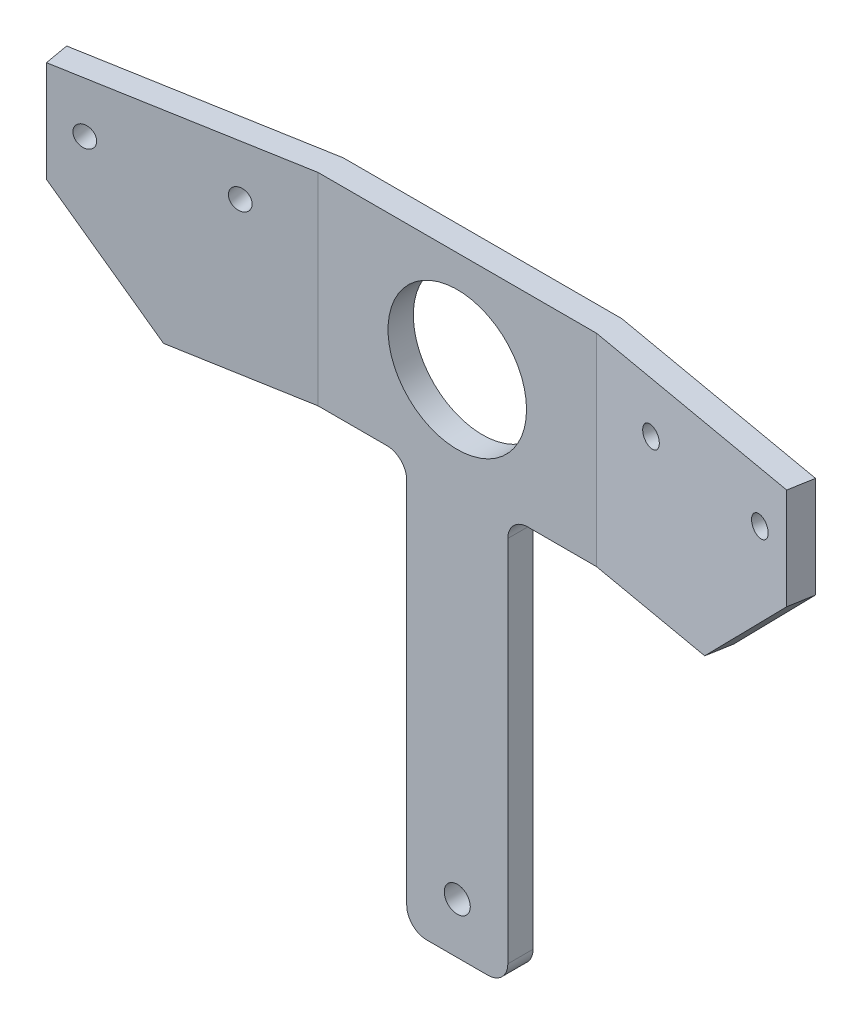
ISO-10303-21;
HEADER;
FILE_DESCRIPTION(('STEP AP214'),'2;1');
FILE_NAME('part.step','',(''),(''),'','','');
FILE_SCHEMA(('AUTOMOTIVE_DESIGN { 1 0 10303 214 1 1 1 1 }'));
ENDSEC;
DATA;
#1=APPLICATION_CONTEXT('core data for automotive mechanical design processes');
#2=APPLICATION_PROTOCOL_DEFINITION('international standard','automotive_design',2000,#1);
#3=PRODUCT_CONTEXT('',#1,'mechanical');
#4=PRODUCT('Part','Part','',(#3));
#5=PRODUCT_RELATED_PRODUCT_CATEGORY('part','',(#4));
#6=PRODUCT_DEFINITION_FORMATION('','',#4);
#7=PRODUCT_DEFINITION_CONTEXT('part definition',#1,'design');
#8=PRODUCT_DEFINITION('design','',#6,#7);
#9=PRODUCT_DEFINITION_SHAPE('','',#8);
#10=(LENGTH_UNIT() NAMED_UNIT(*) SI_UNIT(.MILLI.,.METRE.));
#11=(NAMED_UNIT(*) PLANE_ANGLE_UNIT() SI_UNIT($,.RADIAN.));
#12=(NAMED_UNIT(*) SI_UNIT($,.STERADIAN.) SOLID_ANGLE_UNIT());
#13=UNCERTAINTY_MEASURE_WITH_UNIT(LENGTH_MEASURE(1.E-05),#10,'distance_accuracy_value','');
#14=(GEOMETRIC_REPRESENTATION_CONTEXT(3) GLOBAL_UNCERTAINTY_ASSIGNED_CONTEXT((#13)) GLOBAL_UNIT_ASSIGNED_CONTEXT((#10,
#11,#12)) REPRESENTATION_CONTEXT('',''));
#15=CARTESIAN_POINT('',(0.,0.,0.));
#16=DIRECTION('',(0.,0.,1.));
#17=DIRECTION('',(1.,0.,0.));
#18=AXIS2_PLACEMENT_3D('',#15,#16,#17);
#19=CARTESIAN_POINT('',(0.,102.57,6.35));
#20=DIRECTION('',(0.,-1.,0.));
#21=DIRECTION('',(0.,0.,-1.));
#22=AXIS2_PLACEMENT_3D('',#19,#20,#21);
#23=PLANE('',#22);
#24=DIRECTION('',(0.984807753012208,0.,0.173648177666931));
#25=VECTOR('',#24,1.);
#26=CARTESIAN_POINT('',(35.,102.57,0.));
#27=LINE('',#26,#25);
#28=CARTESIAN_POINT('',(35.,102.57,0.));
#29=VERTEX_POINT('',#28);
#30=CARTESIAN_POINT('',(69.0743482542221,102.57,6.00822694727578));
#31=VERTEX_POINT('',#30);
#32=EDGE_CURVE('E203',#29,#31,#27,.T.);
#33=ORIENTED_EDGE('',*,*,#32,.T.);
#34=DIRECTION('',(-0.173648177666931,0.,0.984807753012208));
#35=VECTOR('',#34,1.);
#36=CARTESIAN_POINT('',(70.8560834926387,102.57,-4.09649571772824));
#37=LINE('',#36,#35);
#38=CARTESIAN_POINT('',(67.9884342991631,102.57,12.166751018271));
#39=VERTEX_POINT('',#38);
#40=EDGE_CURVE('E168',#31,#39,#37,.T.);
#41=ORIENTED_EDGE('',*,*,#40,.T.);
#42=DIRECTION('',(-0.984807753012208,0.,-0.173648177666931));
#43=VECTOR('',#42,1.);
#44=CARTESIAN_POINT('',(93.0025512256735,102.57,16.5774147310111));
#45=LINE('',#44,#43);
#46=CARTESIAN_POINT('',(35.,102.57,6.35));
#47=VERTEX_POINT('',#46);
#48=EDGE_CURVE('E194',#39,#47,#45,.T.);
#49=ORIENTED_EDGE('',*,*,#48,.T.);
#50=DIRECTION('',(-1.,0.,0.));
#51=VECTOR('',#50,1.);
#52=CARTESIAN_POINT('',(0.,102.57,6.35));
#53=LINE('',#52,#51);
#54=CARTESIAN_POINT('',(17.7,102.57,6.35));
#55=VERTEX_POINT('',#54);
#56=EDGE_CURVE('E252',#47,#55,#53,.T.);
#57=ORIENTED_EDGE('',*,*,#56,.T.);
#58=DIRECTION('',(0.,0.,-1.));
#59=VECTOR('',#58,1.);
#60=CARTESIAN_POINT('',(17.7,102.57,6.35));
#61=LINE('',#60,#59);
#62=CARTESIAN_POINT('',(17.7,102.57,0.));
#63=VERTEX_POINT('',#62);
#64=EDGE_CURVE('E304',#55,#63,#61,.T.);
#65=ORIENTED_EDGE('',*,*,#64,.T.);
#66=DIRECTION('',(-1.,0.,0.));
#67=VECTOR('',#66,1.);
#68=CARTESIAN_POINT('',(0.,102.57,0.));
#69=LINE('',#68,#67);
#70=EDGE_CURVE('E228',#29,#63,#69,.T.);
#71=ORIENTED_EDGE('',*,*,#70,.F.);
#72=EDGE_LOOP('',(#33,#41,#49,#57,#65,#71));
#73=FACE_BOUND('',#72,.T.);
#74=ADVANCED_FACE('F41',(#73),#23,.T.);
#75=CARTESIAN_POINT('',(35.,41.2001589004943,0.));
#76=DIRECTION('',(-0.173648177666931,0.,0.984807753012208));
#77=DIRECTION('',(0.984807753012208,0.,0.173648177666931));
#78=AXIS2_PLACEMENT_3D('',#75,#76,#77);
#79=PLANE('',#78);
#80=CARTESIAN_POINT('',(85.9086125588069,140.67,8.97656194455152));
#81=DIRECTION('',(0.173648177666931,0.,-0.984807753012208));
#82=DIRECTION('',(-0.984807753012208,0.,-0.173648177666931));
#83=AXIS2_PLACEMENT_3D('',#80,#81,#82);
#84=CIRCLE('',#83,2.57499999999998);
#85=CARTESIAN_POINT('',(83.3727325948005,140.67,8.52941788705917));
#86=VERTEX_POINT('',#85);
#87=EDGE_CURVE('E321',#86,#86,#84,.T.);
#88=ORIENTED_EDGE('',*,*,#87,.F.);
#89=EDGE_LOOP('',(#88));
#90=FACE_BOUND('',#89,.T.);
#91=CARTESIAN_POINT('',(52.6934801563083,140.67,3.119837934187));
#92=DIRECTION('',(0.173648177666931,0.,-0.984807753012208));
#93=DIRECTION('',(-0.984807753012208,0.,-0.173648177666931));
#94=AXIS2_PLACEMENT_3D('',#91,#92,#93);
#95=CIRCLE('',#94,2.575);
#96=CARTESIAN_POINT('',(50.1576001923019,140.67,2.67269387669465));
#97=VERTEX_POINT('',#96);
#98=EDGE_CURVE('E329',#97,#97,#95,.T.);
#99=ORIENTED_EDGE('',*,*,#98,.F.);
#100=EDGE_LOOP('',(#99));
#101=FACE_BOUND('',#100,.T.);
#102=DIRECTION('',(0.696364240320023,0.707106781186544,0.122787803968974));
#103=VECTOR('',#102,1.);
#104=CARTESIAN_POINT('',(21.8184264691507,54.5850794502476,-2.3242670616813));
#105=LINE('',#104,#103);
#106=CARTESIAN_POINT('',(94.0884651807325,127.97,10.4188906600159));
#107=VERTEX_POINT('',#106);
#108=EDGE_CURVE('E165',#31,#107,#105,.T.);
#109=ORIENTED_EDGE('',*,*,#108,.F.);
#110=ORIENTED_EDGE('',*,*,#32,.F.);
#111=DIRECTION('',(0.,-1.,0.));
#112=VECTOR('',#111,1.);
#113=CARTESIAN_POINT('',(35.,0.,0.));
#114=LINE('',#113,#112);
#115=CARTESIAN_POINT('',(35.,153.37,0.));
#116=VERTEX_POINT('',#115);
#117=EDGE_CURVE('E261',#116,#29,#114,.T.);
#118=ORIENTED_EDGE('',*,*,#117,.F.);
#119=DIRECTION('',(0.984807753012208,0.,0.173648177666931));
#120=VECTOR('',#119,1.);
#121=CARTESIAN_POINT('',(35.,153.37,0.));
#122=LINE('',#121,#120);
#123=CARTESIAN_POINT('',(94.0884651807325,153.37,10.4188906600159));
#124=VERTEX_POINT('',#123);
#125=EDGE_CURVE('E173',#116,#124,#122,.T.);
#126=ORIENTED_EDGE('',*,*,#125,.T.);
#127=DIRECTION('',(0.,1.,0.));
#128=VECTOR('',#127,1.);
#129=CARTESIAN_POINT('',(94.0884651807325,41.2001589004943,10.4188906600159));
#130=LINE('',#129,#128);
#131=EDGE_CURVE('E179',#107,#124,#130,.T.);
#132=ORIENTED_EDGE('',*,*,#131,.F.);
#133=EDGE_LOOP('',(#109,#110,#118,#126,#132));
#134=FACE_BOUND('',#133,.T.);
#135=ADVANCED_FACE('F184',(#90,#101,#134),#79,.F.);
#136=CARTESIAN_POINT('',(94.0884651807325,41.2001589004943,10.4188906600159));
#137=DIRECTION('',(-0.984807753012208,0.,-0.173648177666932));
#138=DIRECTION('',(-0.173648177666932,0.,0.984807753012208));
#139=AXIS2_PLACEMENT_3D('',#136,#137,#138);
#140=PLANE('',#139);
#141=DIRECTION('',(-0.173648177666931,0.,0.984807753012208));
#142=VECTOR('',#141,1.);
#143=CARTESIAN_POINT('',(95.8702004191491,127.97,0.314167995011872));
#144=LINE('',#143,#142);
#145=CARTESIAN_POINT('',(93.0025512256735,127.97,16.5774147310111));
#146=VERTEX_POINT('',#145);
#147=EDGE_CURVE('E57',#107,#146,#144,.T.);
#148=ORIENTED_EDGE('',*,*,#147,.F.);
#149=ORIENTED_EDGE('',*,*,#131,.T.);
#150=DIRECTION('',(-0.173648177666932,0.,0.984807753012208));
#151=VECTOR('',#150,1.);
#152=CARTESIAN_POINT('',(94.0884651807325,153.37,10.4188906600159));
#153=LINE('',#152,#151);
#154=CARTESIAN_POINT('',(93.0025512256735,153.37,16.5774147310111));
#155=VERTEX_POINT('',#154);
#156=EDGE_CURVE('E188',#124,#155,#153,.T.);
#157=ORIENTED_EDGE('',*,*,#156,.T.);
#158=DIRECTION('',(0.,1.,0.));
#159=VECTOR('',#158,1.);
#160=CARTESIAN_POINT('',(93.0025512256735,41.2001589004943,16.5774147310111));
#161=LINE('',#160,#159);
#162=EDGE_CURVE('E181',#146,#155,#161,.T.);
#163=ORIENTED_EDGE('',*,*,#162,.F.);
#164=EDGE_LOOP('',(#148,#149,#157,#163));
#165=FACE_BOUND('',#164,.T.);
#166=ADVANCED_FACE('F177',(#165),#140,.F.);
#167=CARTESIAN_POINT('',(93.0025512256735,41.2001589004943,16.5774147310111));
#168=DIRECTION('',(0.173648177666931,0.,-0.984807753012208));
#169=DIRECTION('',(-0.984807753012208,0.,-0.173648177666931));
#170=AXIS2_PLACEMENT_3D('',#167,#168,#169);
#171=PLANE('',#170);
#172=CARTESIAN_POINT('',(84.8226986037479,140.67,15.1350860155468));
#173=DIRECTION('',(0.173648177666931,0.,-0.984807753012208));
#174=DIRECTION('',(-0.984807753012208,0.,-0.173648177666931));
#175=AXIS2_PLACEMENT_3D('',#172,#173,#174);
#176=CIRCLE('',#175,2.57499999999998);
#177=CARTESIAN_POINT('',(82.2868186397415,140.67,14.6879419580544));
#178=VERTEX_POINT('',#177);
#179=EDGE_CURVE('E182',#178,#178,#176,.T.);
#180=ORIENTED_EDGE('',*,*,#179,.T.);
#181=EDGE_LOOP('',(#180));
#182=FACE_BOUND('',#181,.T.);
#183=CARTESIAN_POINT('',(51.6075662012493,140.67,9.27836200518226));
#184=DIRECTION('',(0.173648177666931,0.,-0.984807753012208));
#185=DIRECTION('',(-0.984807753012208,0.,-0.173648177666931));
#186=AXIS2_PLACEMENT_3D('',#183,#184,#185);
#187=CIRCLE('',#186,2.575);
#188=CARTESIAN_POINT('',(49.0716862372429,140.67,8.83121794768991));
#189=VERTEX_POINT('',#188);
#190=EDGE_CURVE('E318',#189,#189,#187,.T.);
#191=ORIENTED_EDGE('',*,*,#190,.T.);
#192=EDGE_LOOP('',(#191));
#193=FACE_BOUND('',#192,.T.);
#194=DIRECTION('',(-0.696364240320023,-0.707106781186544,-0.122787803968974));
#195=VECTOR('',#194,1.);
#196=CARTESIAN_POINT('',(50.2767451044582,84.5850794502476,9.04370233932196));
#197=LINE('',#196,#195);
#198=EDGE_CURVE('E11',#146,#39,#197,.T.);
#199=ORIENTED_EDGE('',*,*,#198,.F.);
#200=ORIENTED_EDGE('',*,*,#162,.T.);
#201=DIRECTION('',(-0.984807753012208,0.,-0.173648177666931));
#202=VECTOR('',#201,1.);
#203=CARTESIAN_POINT('',(93.0025512256735,153.37,16.5774147310111));
#204=LINE('',#203,#202);
#205=CARTESIAN_POINT('',(35.,153.37,6.35));
#206=VERTEX_POINT('',#205);
#207=EDGE_CURVE('E197',#155,#206,#204,.T.);
#208=ORIENTED_EDGE('',*,*,#207,.T.);
#209=DIRECTION('',(0.,-1.,0.));
#210=VECTOR('',#209,1.);
#211=CARTESIAN_POINT('',(35.,0.,6.35));
#212=LINE('',#211,#210);
#213=EDGE_CURVE('E231',#206,#47,#212,.T.);
#214=ORIENTED_EDGE('',*,*,#213,.T.);
#215=ORIENTED_EDGE('',*,*,#48,.F.);
#216=EDGE_LOOP('',(#199,#200,#208,#214,#215));
#217=FACE_BOUND('',#216,.T.);
#218=ADVANCED_FACE('F353',(#182,#193,#217),#171,.F.);
#219=CARTESIAN_POINT('',(0.,153.37,6.35));
#220=DIRECTION('',(0.,1.,0.));
#221=DIRECTION('',(0.,0.,1.));
#222=AXIS2_PLACEMENT_3D('',#219,#220,#221);
#223=PLANE('',#222);
#224=DIRECTION('',(1.,0.,0.));
#225=VECTOR('',#224,1.);
#226=CARTESIAN_POINT('',(0.,153.37,0.));
#227=LINE('',#226,#225);
#228=CARTESIAN_POINT('',(-35.,153.37,0.));
#229=VERTEX_POINT('',#228);
#230=EDGE_CURVE('E264',#229,#116,#227,.T.);
#231=ORIENTED_EDGE('',*,*,#230,.F.);
#232=DIRECTION('',(-0.984807753012208,0.,0.173648177666931));
#233=VECTOR('',#232,1.);
#234=CARTESIAN_POINT('',(-35.,153.37,0.));
#235=LINE('',#234,#233);
#236=CARTESIAN_POINT('',(-94.0884651807325,153.37,10.4188906600159));
#237=VERTEX_POINT('',#236);
#238=EDGE_CURVE('E205',#229,#237,#235,.T.);
#239=ORIENTED_EDGE('',*,*,#238,.T.);
#240=DIRECTION('',(0.173648177666932,0.,0.984807753012208));
#241=VECTOR('',#240,1.);
#242=CARTESIAN_POINT('',(-94.0884651807325,153.37,10.4188906600159));
#243=LINE('',#242,#241);
#244=CARTESIAN_POINT('',(-93.0025512256735,153.37,16.5774147310111));
#245=VERTEX_POINT('',#244);
#246=EDGE_CURVE('E210',#237,#245,#243,.T.);
#247=ORIENTED_EDGE('',*,*,#246,.T.);
#248=DIRECTION('',(0.984807753012208,0.,-0.173648177666931));
#249=VECTOR('',#248,1.);
#250=CARTESIAN_POINT('',(-93.0025512256735,153.37,16.5774147310111));
#251=LINE('',#250,#249);
#252=CARTESIAN_POINT('',(-35.,153.37,6.35));
#253=VERTEX_POINT('',#252);
#254=EDGE_CURVE('E206',#245,#253,#251,.T.);
#255=ORIENTED_EDGE('',*,*,#254,.T.);
#256=DIRECTION('',(1.,0.,0.));
#257=VECTOR('',#256,1.);
#258=CARTESIAN_POINT('',(0.,153.37,6.35));
#259=LINE('',#258,#257);
#260=EDGE_CURVE('E234',#253,#206,#259,.T.);
#261=ORIENTED_EDGE('',*,*,#260,.T.);
#262=ORIENTED_EDGE('',*,*,#207,.F.);
#263=ORIENTED_EDGE('',*,*,#156,.F.);
#264=ORIENTED_EDGE('',*,*,#125,.F.);
#265=EDGE_LOOP('',(#231,#239,#247,#255,#261,#262,#263,#264));
#266=FACE_BOUND('',#265,.T.);
#267=ADVANCED_FACE('F356',(#266),#223,.T.);
#268=CARTESIAN_POINT('',(0.,102.57,6.35));
#269=DIRECTION('',(0.,-1.,0.));
#270=DIRECTION('',(0.,0.,-1.));
#271=AXIS2_PLACEMENT_3D('',#268,#269,#270);
#272=PLANE('',#271);
#273=DIRECTION('',(0.173648177666931,0.,0.984807753012208));
#274=VECTOR('',#273,1.);
#275=CARTESIAN_POINT('',(-70.8560834926387,102.57,-4.09649571772824));
#276=LINE('',#275,#274);
#277=CARTESIAN_POINT('',(-69.0743482542221,102.57,6.00822694727578));
#278=VERTEX_POINT('',#277);
#279=CARTESIAN_POINT('',(-67.9884342991631,102.57,12.166751018271));
#280=VERTEX_POINT('',#279);
#281=EDGE_CURVE('E65',#278,#280,#276,.T.);
#282=ORIENTED_EDGE('',*,*,#281,.F.);
#283=DIRECTION('',(-0.984807753012208,0.,0.173648177666931));
#284=VECTOR('',#283,1.);
#285=CARTESIAN_POINT('',(-35.,102.57,0.));
#286=LINE('',#285,#284);
#287=CARTESIAN_POINT('',(-35.,102.57,0.));
#288=VERTEX_POINT('',#287);
#289=EDGE_CURVE('E209',#288,#278,#286,.T.);
#290=ORIENTED_EDGE('',*,*,#289,.F.);
#291=DIRECTION('',(-1.,0.,0.));
#292=VECTOR('',#291,1.);
#293=CARTESIAN_POINT('',(0.,102.57,0.));
#294=LINE('',#293,#292);
#295=CARTESIAN_POINT('',(-17.7,102.57,0.));
#296=VERTEX_POINT('',#295);
#297=EDGE_CURVE('E269',#296,#288,#294,.T.);
#298=ORIENTED_EDGE('',*,*,#297,.F.);
#299=DIRECTION('',(0.,0.,-1.));
#300=VECTOR('',#299,1.);
#301=CARTESIAN_POINT('',(-17.7,102.57,6.35));
#302=LINE('',#301,#300);
#303=CARTESIAN_POINT('',(-17.7,102.57,6.35));
#304=VERTEX_POINT('',#303);
#305=EDGE_CURVE('E307',#296,#304,#302,.F.);
#306=ORIENTED_EDGE('',*,*,#305,.T.);
#307=DIRECTION('',(-1.,0.,0.));
#308=VECTOR('',#307,1.);
#309=CARTESIAN_POINT('',(0.,102.57,6.35));
#310=LINE('',#309,#308);
#311=CARTESIAN_POINT('',(-35.,102.57,6.35));
#312=VERTEX_POINT('',#311);
#313=EDGE_CURVE('E240',#304,#312,#310,.T.);
#314=ORIENTED_EDGE('',*,*,#313,.T.);
#315=DIRECTION('',(0.984807753012208,0.,-0.173648177666931));
#316=VECTOR('',#315,1.);
#317=CARTESIAN_POINT('',(-93.0025512256735,102.57,16.5774147310111));
#318=LINE('',#317,#316);
#319=EDGE_CURVE('E218',#280,#312,#318,.T.);
#320=ORIENTED_EDGE('',*,*,#319,.F.);
#321=EDGE_LOOP('',(#282,#290,#298,#306,#314,#320));
#322=FACE_BOUND('',#321,.T.);
#323=ADVANCED_FACE('F365',(#322),#272,.T.);
#324=CARTESIAN_POINT('',(-12.7,0.,6.35));
#325=DIRECTION('',(-1.,0.,0.));
#326=DIRECTION('',(0.,0.,1.));
#327=AXIS2_PLACEMENT_3D('',#324,#325,#326);
#328=PLANE('',#327);
#329=DIRECTION('',(0.,1.,0.));
#330=VECTOR('',#329,1.);
#331=CARTESIAN_POINT('',(-12.7,0.,0.));
#332=LINE('',#331,#330);
#333=CARTESIAN_POINT('',(-12.7,5.,0.));
#334=VERTEX_POINT('',#333);
#335=CARTESIAN_POINT('',(-12.7,97.57,0.));
#336=VERTEX_POINT('',#335);
#337=EDGE_CURVE('E271',#334,#336,#332,.T.);
#338=ORIENTED_EDGE('',*,*,#337,.F.);
#339=DIRECTION('',(0.,0.,-1.));
#340=VECTOR('',#339,1.);
#341=CARTESIAN_POINT('',(-12.7,5.,6.35));
#342=LINE('',#341,#340);
#343=CARTESIAN_POINT('',(-12.7,5.,6.35));
#344=VERTEX_POINT('',#343);
#345=EDGE_CURVE('E293',#334,#344,#342,.F.);
#346=ORIENTED_EDGE('',*,*,#345,.T.);
#347=DIRECTION('',(0.,1.,0.));
#348=VECTOR('',#347,1.);
#349=CARTESIAN_POINT('',(-12.7,0.,6.35));
#350=LINE('',#349,#348);
#351=CARTESIAN_POINT('',(-12.7,97.57,6.35));
#352=VERTEX_POINT('',#351);
#353=EDGE_CURVE('E243',#344,#352,#350,.T.);
#354=ORIENTED_EDGE('',*,*,#353,.T.);
#355=DIRECTION('',(0.,0.,-1.));
#356=VECTOR('',#355,1.);
#357=CARTESIAN_POINT('',(-12.7,97.57,0.));
#358=LINE('',#357,#356);
#359=EDGE_CURVE('E290',#352,#336,#358,.T.);
#360=ORIENTED_EDGE('',*,*,#359,.T.);
#361=EDGE_LOOP('',(#338,#346,#354,#360));
#362=FACE_BOUND('',#361,.T.);
#363=ADVANCED_FACE('F373',(#362),#328,.T.);
#364=CARTESIAN_POINT('',(0.,0.,6.35));
#365=DIRECTION('',(0.,1.,0.));
#366=DIRECTION('',(-1.,0.,0.));
#367=AXIS2_PLACEMENT_3D('',#364,#365,#366);
#368=PLANE('',#367);
#369=DIRECTION('',(1.,0.,0.));
#370=VECTOR('',#369,1.);
#371=CARTESIAN_POINT('',(0.,0.,6.35));
#372=LINE('',#371,#370);
#373=CARTESIAN_POINT('',(-7.7,0.,6.35));
#374=VERTEX_POINT('',#373);
#375=CARTESIAN_POINT('',(7.7,0.,6.35));
#376=VERTEX_POINT('',#375);
#377=EDGE_CURVE('E246',#374,#376,#372,.T.);
#378=ORIENTED_EDGE('',*,*,#377,.F.);
#379=DIRECTION('',(0.,0.,-1.));
#380=VECTOR('',#379,1.);
#381=CARTESIAN_POINT('',(-7.7,0.,0.));
#382=LINE('',#381,#380);
#383=CARTESIAN_POINT('',(-7.7,0.,0.));
#384=VERTEX_POINT('',#383);
#385=EDGE_CURVE('E283',#374,#384,#382,.T.);
#386=ORIENTED_EDGE('',*,*,#385,.T.);
#387=DIRECTION('',(1.,0.,0.));
#388=VECTOR('',#387,1.);
#389=CARTESIAN_POINT('',(0.,0.,0.));
#390=LINE('',#389,#388);
#391=CARTESIAN_POINT('',(7.7,0.,0.));
#392=VERTEX_POINT('',#391);
#393=EDGE_CURVE('E274',#384,#392,#390,.T.);
#394=ORIENTED_EDGE('',*,*,#393,.T.);
#395=DIRECTION('',(0.,0.,-1.));
#396=VECTOR('',#395,1.);
#397=CARTESIAN_POINT('',(7.7,0.,6.35));
#398=LINE('',#397,#396);
#399=EDGE_CURVE('E255',#392,#376,#398,.F.);
#400=ORIENTED_EDGE('',*,*,#399,.T.);
#401=EDGE_LOOP('',(#378,#386,#394,#400));
#402=FACE_BOUND('',#401,.T.);
#403=ADVANCED_FACE('F384',(#402),#368,.F.);
#404=CARTESIAN_POINT('',(12.7,0.,6.35));
#405=DIRECTION('',(-1.,0.,0.));
#406=DIRECTION('',(0.,-1.,0.));
#407=AXIS2_PLACEMENT_3D('',#404,#405,#406);
#408=PLANE('',#407);
#409=DIRECTION('',(0.,1.,0.));
#410=VECTOR('',#409,1.);
#411=CARTESIAN_POINT('',(12.7,0.,6.35));
#412=LINE('',#411,#410);
#413=CARTESIAN_POINT('',(12.7,5.00000000000001,6.35));
#414=VERTEX_POINT('',#413);
#415=CARTESIAN_POINT('',(12.7,97.57,6.35));
#416=VERTEX_POINT('',#415);
#417=EDGE_CURVE('E249',#414,#416,#412,.T.);
#418=ORIENTED_EDGE('',*,*,#417,.F.);
#419=DIRECTION('',(0.,0.,-1.));
#420=VECTOR('',#419,1.);
#421=CARTESIAN_POINT('',(12.7,5.00000000000001,6.35));
#422=LINE('',#421,#420);
#423=CARTESIAN_POINT('',(12.7,5.00000000000001,0.));
#424=VERTEX_POINT('',#423);
#425=EDGE_CURVE('E301',#414,#424,#422,.T.);
#426=ORIENTED_EDGE('',*,*,#425,.T.);
#427=DIRECTION('',(0.,1.,0.));
#428=VECTOR('',#427,1.);
#429=CARTESIAN_POINT('',(12.7,0.,0.));
#430=LINE('',#429,#428);
#431=CARTESIAN_POINT('',(12.7,97.57,0.));
#432=VERTEX_POINT('',#431);
#433=EDGE_CURVE('E277',#424,#432,#430,.T.);
#434=ORIENTED_EDGE('',*,*,#433,.T.);
#435=DIRECTION('',(0.,0.,-1.));
#436=VECTOR('',#435,1.);
#437=CARTESIAN_POINT('',(12.7,97.57,6.35));
#438=LINE('',#437,#436);
#439=EDGE_CURVE('E299',#432,#416,#438,.F.);
#440=ORIENTED_EDGE('',*,*,#439,.T.);
#441=EDGE_LOOP('',(#418,#426,#434,#440));
#442=FACE_BOUND('',#441,.T.);
#443=ADVANCED_FACE('F393',(#442),#408,.F.);
#444=CARTESIAN_POINT('',(0.,127.97,6.35));
#445=DIRECTION('',(0.,0.,-1.));
#446=DIRECTION('',(-1.,0.,0.));
#447=AXIS2_PLACEMENT_3D('',#444,#445,#446);
#448=CYLINDRICAL_SURFACE('',#447,17.4);
#449=CARTESIAN_POINT('',(0.,127.97,6.35));
#450=DIRECTION('',(0.,0.,1.));
#451=DIRECTION('',(1.,0.,0.));
#452=AXIS2_PLACEMENT_3D('',#449,#450,#451);
#453=CIRCLE('',#452,17.4);
#454=CARTESIAN_POINT('',(17.4,127.97,6.35));
#455=VERTEX_POINT('',#454);
#456=EDGE_CURVE('E227',#455,#455,#453,.T.);
#457=ORIENTED_EDGE('',*,*,#456,.T.);
#458=EDGE_LOOP('',(#457));
#459=FACE_BOUND('',#458,.T.);
#460=CARTESIAN_POINT('',(0.,127.97,0.));
#461=DIRECTION('',(0.,0.,1.));
#462=DIRECTION('',(1.,0.,0.));
#463=AXIS2_PLACEMENT_3D('',#460,#461,#462);
#464=CIRCLE('',#463,17.4);
#465=CARTESIAN_POINT('',(17.4,127.97,0.));
#466=VERTEX_POINT('',#465);
#467=EDGE_CURVE('E258',#466,#466,#464,.T.);
#468=ORIENTED_EDGE('',*,*,#467,.F.);
#469=EDGE_LOOP('',(#468));
#470=FACE_BOUND('',#469,.T.);
#471=ADVANCED_FACE('F432',(#459,#470),#448,.F.);
#472=CARTESIAN_POINT('',(0.,12.7,6.35));
#473=DIRECTION('',(0.,0.,-1.));
#474=DIRECTION('',(-1.,0.,0.));
#475=AXIS2_PLACEMENT_3D('',#472,#473,#474);
#476=CYLINDRICAL_SURFACE('',#475,3.265);
#477=CARTESIAN_POINT('',(0.,12.7,6.35));
#478=DIRECTION('',(0.,0.,1.));
#479=DIRECTION('',(1.,0.,0.));
#480=AXIS2_PLACEMENT_3D('',#477,#478,#479);
#481=CIRCLE('',#480,3.265);
#482=CARTESIAN_POINT('',(3.265,12.7,6.35));
#483=VERTEX_POINT('',#482);
#484=EDGE_CURVE('E224',#483,#483,#481,.T.);
#485=ORIENTED_EDGE('',*,*,#484,.T.);
#486=EDGE_LOOP('',(#485));
#487=FACE_BOUND('',#486,.T.);
#488=CARTESIAN_POINT('',(0.,12.7,0.));
#489=DIRECTION('',(0.,0.,1.));
#490=DIRECTION('',(1.,0.,0.));
#491=AXIS2_PLACEMENT_3D('',#488,#489,#490);
#492=CIRCLE('',#491,3.265);
#493=CARTESIAN_POINT('',(3.265,12.7,0.));
#494=VERTEX_POINT('',#493);
#495=EDGE_CURVE('E220',#494,#494,#492,.T.);
#496=ORIENTED_EDGE('',*,*,#495,.F.);
#497=EDGE_LOOP('',(#496));
#498=FACE_BOUND('',#497,.T.);
#499=ADVANCED_FACE('F443',(#487,#498),#476,.F.);
#500=CARTESIAN_POINT('',(0.,0.,6.35));
#501=DIRECTION('',(0.,0.,1.));
#502=DIRECTION('',(1.,0.,0.));
#503=AXIS2_PLACEMENT_3D('',#500,#501,#502);
#504=PLANE('',#503);
#505=ORIENTED_EDGE('',*,*,#484,.F.);
#506=EDGE_LOOP('',(#505));
#507=FACE_BOUND('',#506,.T.);
#508=ORIENTED_EDGE('',*,*,#456,.F.);
#509=EDGE_LOOP('',(#508));
#510=FACE_BOUND('',#509,.T.);
#511=ORIENTED_EDGE('',*,*,#353,.F.);
#512=CARTESIAN_POINT('',(-7.7,5.,6.35));
#513=DIRECTION('',(0.,0.,1.));
#514=DIRECTION('',(1.,0.,0.));
#515=AXIS2_PLACEMENT_3D('',#512,#513,#514);
#516=CIRCLE('',#515,5.);
#517=EDGE_CURVE('E297',#344,#374,#516,.T.);
#518=ORIENTED_EDGE('',*,*,#517,.T.);
#519=ORIENTED_EDGE('',*,*,#377,.T.);
#520=CARTESIAN_POINT('',(7.7,5.,6.35));
#521=DIRECTION('',(0.,0.,1.));
#522=DIRECTION('',(1.,0.,0.));
#523=AXIS2_PLACEMENT_3D('',#520,#521,#522);
#524=CIRCLE('',#523,5.);
#525=EDGE_CURVE('E295',#376,#414,#524,.T.);
#526=ORIENTED_EDGE('',*,*,#525,.T.);
#527=ORIENTED_EDGE('',*,*,#417,.T.);
#528=CARTESIAN_POINT('',(17.7,97.57,6.35));
#529=DIRECTION('',(0.,0.,1.));
#530=DIRECTION('',(1.,0.,0.));
#531=AXIS2_PLACEMENT_3D('',#528,#529,#530);
#532=CIRCLE('',#531,5.);
#533=EDGE_CURVE('E311',#416,#55,#532,.F.);
#534=ORIENTED_EDGE('',*,*,#533,.T.);
#535=ORIENTED_EDGE('',*,*,#56,.F.);
#536=ORIENTED_EDGE('',*,*,#213,.F.);
#537=ORIENTED_EDGE('',*,*,#260,.F.);
#538=DIRECTION('',(0.,-1.,0.));
#539=VECTOR('',#538,1.);
#540=CARTESIAN_POINT('',(-35.,0.,6.35));
#541=LINE('',#540,#539);
#542=EDGE_CURVE('E237',#253,#312,#541,.T.);
#543=ORIENTED_EDGE('',*,*,#542,.T.);
#544=ORIENTED_EDGE('',*,*,#313,.F.);
#545=CARTESIAN_POINT('',(-17.7,97.57,6.35));
#546=DIRECTION('',(0.,0.,1.));
#547=DIRECTION('',(1.,0.,0.));
#548=AXIS2_PLACEMENT_3D('',#545,#546,#547);
#549=CIRCLE('',#548,5.);
#550=EDGE_CURVE('E315',#304,#352,#549,.F.);
#551=ORIENTED_EDGE('',*,*,#550,.T.);
#552=EDGE_LOOP('',(#511,#518,#519,#526,#527,#534,#535,#536,#537,#543,#544,#551));
#553=FACE_BOUND('',#552,.T.);
#554=ADVANCED_FACE('F351',(#507,#510,#553),#504,.T.);
#555=CARTESIAN_POINT('',(0.,0.,0.));
#556=DIRECTION('',(0.,0.,1.));
#557=DIRECTION('',(1.,0.,0.));
#558=AXIS2_PLACEMENT_3D('',#555,#556,#557);
#559=PLANE('',#558);
#560=ORIENTED_EDGE('',*,*,#495,.T.);
#561=EDGE_LOOP('',(#560));
#562=FACE_BOUND('',#561,.T.);
#563=ORIENTED_EDGE('',*,*,#467,.T.);
#564=EDGE_LOOP('',(#563));
#565=FACE_BOUND('',#564,.T.);
#566=ORIENTED_EDGE('',*,*,#393,.F.);
#567=CARTESIAN_POINT('',(-7.7,5.,0.));
#568=DIRECTION('',(0.,0.,1.));
#569=DIRECTION('',(1.,0.,0.));
#570=AXIS2_PLACEMENT_3D('',#567,#568,#569);
#571=CIRCLE('',#570,5.);
#572=EDGE_CURVE('E288',#384,#334,#571,.F.);
#573=ORIENTED_EDGE('',*,*,#572,.T.);
#574=ORIENTED_EDGE('',*,*,#337,.T.);
#575=CARTESIAN_POINT('',(-17.7,97.57,0.));
#576=DIRECTION('',(0.,0.,1.));
#577=DIRECTION('',(1.,0.,0.));
#578=AXIS2_PLACEMENT_3D('',#575,#576,#577);
#579=CIRCLE('',#578,5.);
#580=EDGE_CURVE('E313',#336,#296,#579,.T.);
#581=ORIENTED_EDGE('',*,*,#580,.T.);
#582=ORIENTED_EDGE('',*,*,#297,.T.);
#583=DIRECTION('',(0.,-1.,0.));
#584=VECTOR('',#583,1.);
#585=CARTESIAN_POINT('',(-35.,0.,0.));
#586=LINE('',#585,#584);
#587=EDGE_CURVE('E266',#229,#288,#586,.T.);
#588=ORIENTED_EDGE('',*,*,#587,.F.);
#589=ORIENTED_EDGE('',*,*,#230,.T.);
#590=ORIENTED_EDGE('',*,*,#117,.T.);
#591=ORIENTED_EDGE('',*,*,#70,.T.);
#592=CARTESIAN_POINT('',(17.7,97.57,0.));
#593=DIRECTION('',(0.,0.,1.));
#594=DIRECTION('',(1.,0.,0.));
#595=AXIS2_PLACEMENT_3D('',#592,#593,#594);
#596=CIRCLE('',#595,5.);
#597=EDGE_CURVE('E309',#63,#432,#596,.T.);
#598=ORIENTED_EDGE('',*,*,#597,.T.);
#599=ORIENTED_EDGE('',*,*,#433,.F.);
#600=CARTESIAN_POINT('',(7.7,5.,0.));
#601=DIRECTION('',(0.,0.,1.));
#602=DIRECTION('',(1.,0.,0.));
#603=AXIS2_PLACEMENT_3D('',#600,#601,#602);
#604=CIRCLE('',#603,5.);
#605=EDGE_CURVE('E286',#424,#392,#604,.F.);
#606=ORIENTED_EDGE('',*,*,#605,.T.);
#607=EDGE_LOOP('',(#566,#573,#574,#581,#582,#588,#589,#590,#591,#598,#599,#606));
#608=FACE_BOUND('',#607,.T.);
#609=ADVANCED_FACE('F377',(#562,#565,#608),#559,.F.);
#610=CARTESIAN_POINT('',(-7.7,5.,6.35));
#611=DIRECTION('',(0.,0.,1.));
#612=DIRECTION('',(1.,0.,0.));
#613=AXIS2_PLACEMENT_3D('',#610,#611,#612);
#614=CYLINDRICAL_SURFACE('',#613,5.);
#615=ORIENTED_EDGE('',*,*,#517,.F.);
#616=ORIENTED_EDGE('',*,*,#345,.F.);
#617=ORIENTED_EDGE('',*,*,#572,.F.);
#618=ORIENTED_EDGE('',*,*,#385,.F.);
#619=EDGE_LOOP('',(#615,#616,#617,#618));
#620=FACE_BOUND('',#619,.T.);
#621=ADVANCED_FACE('F381',(#620),#614,.T.);
#622=CARTESIAN_POINT('',(7.7,5.,6.35));
#623=DIRECTION('',(0.,0.,-1.));
#624=DIRECTION('',(-1.,0.,0.));
#625=AXIS2_PLACEMENT_3D('',#622,#623,#624);
#626=CYLINDRICAL_SURFACE('',#625,5.);
#627=ORIENTED_EDGE('',*,*,#525,.F.);
#628=ORIENTED_EDGE('',*,*,#399,.F.);
#629=ORIENTED_EDGE('',*,*,#605,.F.);
#630=ORIENTED_EDGE('',*,*,#425,.F.);
#631=EDGE_LOOP('',(#627,#628,#629,#630));
#632=FACE_BOUND('',#631,.T.);
#633=ADVANCED_FACE('F390',(#632),#626,.T.);
#634=CARTESIAN_POINT('',(17.7,97.57,6.35));
#635=DIRECTION('',(0.,0.,-1.));
#636=DIRECTION('',(-1.,0.,0.));
#637=AXIS2_PLACEMENT_3D('',#634,#635,#636);
#638=CYLINDRICAL_SURFACE('',#637,5.);
#639=ORIENTED_EDGE('',*,*,#533,.F.);
#640=ORIENTED_EDGE('',*,*,#439,.F.);
#641=ORIENTED_EDGE('',*,*,#597,.F.);
#642=ORIENTED_EDGE('',*,*,#64,.F.);
#643=EDGE_LOOP('',(#639,#640,#641,#642));
#644=FACE_BOUND('',#643,.T.);
#645=ADVANCED_FACE('F396',(#644),#638,.F.);
#646=CARTESIAN_POINT('',(-17.7,97.57,6.35));
#647=DIRECTION('',(0.,0.,1.));
#648=DIRECTION('',(1.,0.,0.));
#649=AXIS2_PLACEMENT_3D('',#646,#647,#648);
#650=CYLINDRICAL_SURFACE('',#649,5.);
#651=ORIENTED_EDGE('',*,*,#550,.F.);
#652=ORIENTED_EDGE('',*,*,#305,.F.);
#653=ORIENTED_EDGE('',*,*,#580,.F.);
#654=ORIENTED_EDGE('',*,*,#359,.F.);
#655=EDGE_LOOP('',(#651,#652,#653,#654));
#656=FACE_BOUND('',#655,.T.);
#657=ADVANCED_FACE('F43',(#656),#650,.F.);
#658=CARTESIAN_POINT('',(-35.,41.2001589004943,0.));
#659=DIRECTION('',(-0.173648177666931,0.,-0.984807753012208));
#660=DIRECTION('',(-0.984807753012208,0.,0.173648177666931));
#661=AXIS2_PLACEMENT_3D('',#658,#659,#660);
#662=PLANE('',#661);
#663=CARTESIAN_POINT('',(-85.9086125588069,140.67,8.97656194455152));
#664=DIRECTION('',(0.173648177666931,0.,0.984807753012208));
#665=DIRECTION('',(0.984807753012208,0.,-0.173648177666931));
#666=AXIS2_PLACEMENT_3D('',#663,#664,#665);
#667=CIRCLE('',#666,2.57499999999998);
#668=CARTESIAN_POINT('',(-83.3727325948005,140.67,8.52941788705917));
#669=VERTEX_POINT('',#668);
#670=EDGE_CURVE('E325',#669,#669,#667,.T.);
#671=ORIENTED_EDGE('',*,*,#670,.T.);
#672=EDGE_LOOP('',(#671));
#673=FACE_BOUND('',#672,.T.);
#674=CARTESIAN_POINT('',(-52.6934801563083,140.67,3.119837934187));
#675=DIRECTION('',(0.173648177666931,0.,0.984807753012208));
#676=DIRECTION('',(0.984807753012208,0.,-0.173648177666931));
#677=AXIS2_PLACEMENT_3D('',#674,#675,#676);
#678=CIRCLE('',#677,2.575);
#679=CARTESIAN_POINT('',(-50.1576001923019,140.67,2.67269387669465));
#680=VERTEX_POINT('',#679);
#681=EDGE_CURVE('E331',#680,#680,#678,.T.);
#682=ORIENTED_EDGE('',*,*,#681,.T.);
#683=EDGE_LOOP('',(#682));
#684=FACE_BOUND('',#683,.T.);
#685=DIRECTION('',(0.696364240320023,-0.707106781186544,-0.122787803968974));
#686=VECTOR('',#685,1.);
#687=CARTESIAN_POINT('',(-21.8184264691507,54.5850794502476,-2.3242670616813));
#688=LINE('',#687,#686);
#689=CARTESIAN_POINT('',(-94.0884651807325,127.97,10.4188906600159));
#690=VERTEX_POINT('',#689);
#691=EDGE_CURVE('E201',#690,#278,#688,.T.);
#692=ORIENTED_EDGE('',*,*,#691,.F.);
#693=DIRECTION('',(0.,1.,0.));
#694=VECTOR('',#693,1.);
#695=CARTESIAN_POINT('',(-94.0884651807325,41.2001589004943,10.4188906600159));
#696=LINE('',#695,#694);
#697=EDGE_CURVE('E217',#690,#237,#696,.T.);
#698=ORIENTED_EDGE('',*,*,#697,.T.);
#699=ORIENTED_EDGE('',*,*,#238,.F.);
#700=ORIENTED_EDGE('',*,*,#587,.T.);
#701=ORIENTED_EDGE('',*,*,#289,.T.);
#702=EDGE_LOOP('',(#692,#698,#699,#700,#701));
#703=FACE_BOUND('',#702,.T.);
#704=ADVANCED_FACE('F402',(#673,#684,#703),#662,.T.);
#705=CARTESIAN_POINT('',(-94.0884651807325,41.2001589004943,10.4188906600159));
#706=DIRECTION('',(-0.984807753012208,0.,0.173648177666932));
#707=DIRECTION('',(0.173648177666932,0.,0.984807753012208));
#708=AXIS2_PLACEMENT_3D('',#705,#706,#707);
#709=PLANE('',#708);
#710=DIRECTION('',(0.173648177666931,0.,0.984807753012208));
#711=VECTOR('',#710,1.);
#712=CARTESIAN_POINT('',(-95.8702004191491,127.97,0.314167995011872));
#713=LINE('',#712,#711);
#714=CARTESIAN_POINT('',(-93.0025512256735,127.97,16.5774147310111));
#715=VERTEX_POINT('',#714);
#716=EDGE_CURVE('E198',#690,#715,#713,.T.);
#717=ORIENTED_EDGE('',*,*,#716,.T.);
#718=DIRECTION('',(0.,1.,0.));
#719=VECTOR('',#718,1.);
#720=CARTESIAN_POINT('',(-93.0025512256735,41.2001589004943,16.5774147310111));
#721=LINE('',#720,#719);
#722=EDGE_CURVE('E221',#715,#245,#721,.T.);
#723=ORIENTED_EDGE('',*,*,#722,.T.);
#724=ORIENTED_EDGE('',*,*,#246,.F.);
#725=ORIENTED_EDGE('',*,*,#697,.F.);
#726=EDGE_LOOP('',(#717,#723,#724,#725));
#727=FACE_BOUND('',#726,.T.);
#728=ADVANCED_FACE('F406',(#727),#709,.T.);
#729=CARTESIAN_POINT('',(-93.0025512256735,41.2001589004943,16.5774147310111));
#730=DIRECTION('',(0.173648177666931,0.,0.984807753012208));
#731=DIRECTION('',(0.984807753012208,0.,-0.173648177666931));
#732=AXIS2_PLACEMENT_3D('',#729,#730,#731);
#733=PLANE('',#732);
#734=CARTESIAN_POINT('',(-84.8226986037479,140.67,15.1350860155468));
#735=DIRECTION('',(0.173648177666931,0.,0.984807753012208));
#736=DIRECTION('',(0.984807753012208,0.,-0.173648177666931));
#737=AXIS2_PLACEMENT_3D('',#734,#735,#736);
#738=CIRCLE('',#737,2.57499999999998);
#739=CARTESIAN_POINT('',(-82.2868186397415,140.67,14.6879419580544));
#740=VERTEX_POINT('',#739);
#741=EDGE_CURVE('E45',#740,#740,#738,.F.);
#742=ORIENTED_EDGE('',*,*,#741,.T.);
#743=EDGE_LOOP('',(#742));
#744=FACE_BOUND('',#743,.T.);
#745=CARTESIAN_POINT('',(-51.6075662012493,140.67,9.27836200518226));
#746=DIRECTION('',(0.173648177666931,0.,0.984807753012208));
#747=DIRECTION('',(0.984807753012208,0.,-0.173648177666931));
#748=AXIS2_PLACEMENT_3D('',#745,#746,#747);
#749=CIRCLE('',#748,2.575);
#750=CARTESIAN_POINT('',(-49.0716862372429,140.67,8.83121794768991));
#751=VERTEX_POINT('',#750);
#752=EDGE_CURVE('E323',#751,#751,#749,.F.);
#753=ORIENTED_EDGE('',*,*,#752,.T.);
#754=EDGE_LOOP('',(#753));
#755=FACE_BOUND('',#754,.T.);
#756=DIRECTION('',(-0.696364240320023,0.707106781186544,0.122787803968974));
#757=VECTOR('',#756,1.);
#758=CARTESIAN_POINT('',(-50.2767451044582,84.5850794502476,9.04370233932196));
#759=LINE('',#758,#757);
#760=EDGE_CURVE('E50',#280,#715,#759,.T.);
#761=ORIENTED_EDGE('',*,*,#760,.F.);
#762=ORIENTED_EDGE('',*,*,#319,.T.);
#763=ORIENTED_EDGE('',*,*,#542,.F.);
#764=ORIENTED_EDGE('',*,*,#254,.F.);
#765=ORIENTED_EDGE('',*,*,#722,.F.);
#766=EDGE_LOOP('',(#761,#762,#763,#764,#765));
#767=FACE_BOUND('',#766,.T.);
#768=ADVANCED_FACE('F361',(#744,#755,#767),#733,.T.);
#769=CARTESIAN_POINT('',(-95.8702004191491,127.97,0.314167995011872));
#770=DIRECTION('',(0.696364240320015,0.707106781186551,-0.122787803968973));
#771=DIRECTION('',(-0.712498293208674,0.701673843159859,0.));
#772=AXIS2_PLACEMENT_3D('',#769,#770,#771);
#773=PLANE('',#772);
#774=ORIENTED_EDGE('',*,*,#691,.T.);
#775=ORIENTED_EDGE('',*,*,#281,.T.);
#776=ORIENTED_EDGE('',*,*,#760,.T.);
#777=ORIENTED_EDGE('',*,*,#716,.F.);
#778=EDGE_LOOP('',(#774,#775,#776,#777));
#779=FACE_BOUND('',#778,.T.);
#780=ADVANCED_FACE('F407',(#779),#773,.F.);
#781=CARTESIAN_POINT('',(95.8702004191491,127.97,0.314167995011872));
#782=DIRECTION('',(0.696364240320015,-0.707106781186551,0.122787803968973));
#783=DIRECTION('',(0.712498293208674,0.701673843159859,0.));
#784=AXIS2_PLACEMENT_3D('',#781,#782,#783);
#785=PLANE('',#784);
#786=ORIENTED_EDGE('',*,*,#108,.T.);
#787=ORIENTED_EDGE('',*,*,#147,.T.);
#788=ORIENTED_EDGE('',*,*,#198,.T.);
#789=ORIENTED_EDGE('',*,*,#40,.F.);
#790=EDGE_LOOP('',(#786,#787,#788,#789));
#791=FACE_BOUND('',#790,.T.);
#792=ADVANCED_FACE('F166',(#791),#785,.T.);
#793=CARTESIAN_POINT('',(50.956998379639,140.67,12.9679154643091));
#794=DIRECTION('',(0.173648177666931,0.,-0.984807753012208));
#795=DIRECTION('',(-0.984807753012208,0.,-0.173648177666931));
#796=AXIS2_PLACEMENT_3D('',#793,#794,#795);
#797=CYLINDRICAL_SURFACE('',#796,2.575);
#798=ORIENTED_EDGE('',*,*,#98,.T.);
#799=EDGE_LOOP('',(#798));
#800=FACE_BOUND('',#799,.T.);
#801=ORIENTED_EDGE('',*,*,#190,.F.);
#802=EDGE_LOOP('',(#801));
#803=FACE_BOUND('',#802,.T.);
#804=ADVANCED_FACE('F415',(#800,#803),#797,.F.);
#805=CARTESIAN_POINT('',(84.1721307821376,140.67,18.8246394746736));
#806=DIRECTION('',(0.173648177666931,0.,-0.984807753012208));
#807=DIRECTION('',(-0.984807753012208,0.,-0.173648177666931));
#808=AXIS2_PLACEMENT_3D('',#805,#806,#807);
#809=CYLINDRICAL_SURFACE('',#808,2.57499999999998);
#810=ORIENTED_EDGE('',*,*,#87,.T.);
#811=EDGE_LOOP('',(#810));
#812=FACE_BOUND('',#811,.T.);
#813=ORIENTED_EDGE('',*,*,#179,.F.);
#814=EDGE_LOOP('',(#813));
#815=FACE_BOUND('',#814,.T.);
#816=ADVANCED_FACE('F506',(#812,#815),#809,.F.);
#817=CARTESIAN_POINT('',(-50.956998379639,140.67,12.9679154643091));
#818=DIRECTION('',(-0.173648177666931,0.,-0.984807753012208));
#819=DIRECTION('',(-0.984807753012208,0.,0.173648177666931));
#820=AXIS2_PLACEMENT_3D('',#817,#818,#819);
#821=CYLINDRICAL_SURFACE('',#820,2.575);
#822=ORIENTED_EDGE('',*,*,#752,.F.);
#823=EDGE_LOOP('',(#822));
#824=FACE_BOUND('',#823,.T.);
#825=ORIENTED_EDGE('',*,*,#681,.F.);
#826=EDGE_LOOP('',(#825));
#827=FACE_BOUND('',#826,.T.);
#828=ADVANCED_FACE('F514',(#824,#827),#821,.F.);
#829=CARTESIAN_POINT('',(-84.1721307821376,140.67,18.8246394746736));
#830=DIRECTION('',(-0.173648177666931,0.,-0.984807753012208));
#831=DIRECTION('',(-0.984807753012208,0.,0.173648177666931));
#832=AXIS2_PLACEMENT_3D('',#829,#830,#831);
#833=CYLINDRICAL_SURFACE('',#832,2.57499999999998);
#834=ORIENTED_EDGE('',*,*,#741,.F.);
#835=EDGE_LOOP('',(#834));
#836=FACE_BOUND('',#835,.T.);
#837=ORIENTED_EDGE('',*,*,#670,.F.);
#838=EDGE_LOOP('',(#837));
#839=FACE_BOUND('',#838,.T.);
#840=ADVANCED_FACE('F527',(#836,#839),#833,.F.);
#841=CLOSED_SHELL('',(#74,#135,#166,#218,#267,#323,#363,#403,#443,#471,#499,#554,#609,#621,#633,
#645,#657,#704,#728,#768,#780,#792,#804,#816,#828,#840));
#842=MANIFOLD_SOLID_BREP('B2',#841);
#843=ADVANCED_BREP_SHAPE_REPRESENTATION('',(#18,#842),#14);
#844=SHAPE_DEFINITION_REPRESENTATION(#9,#843);
ENDSEC;
END-ISO-10303-21;
